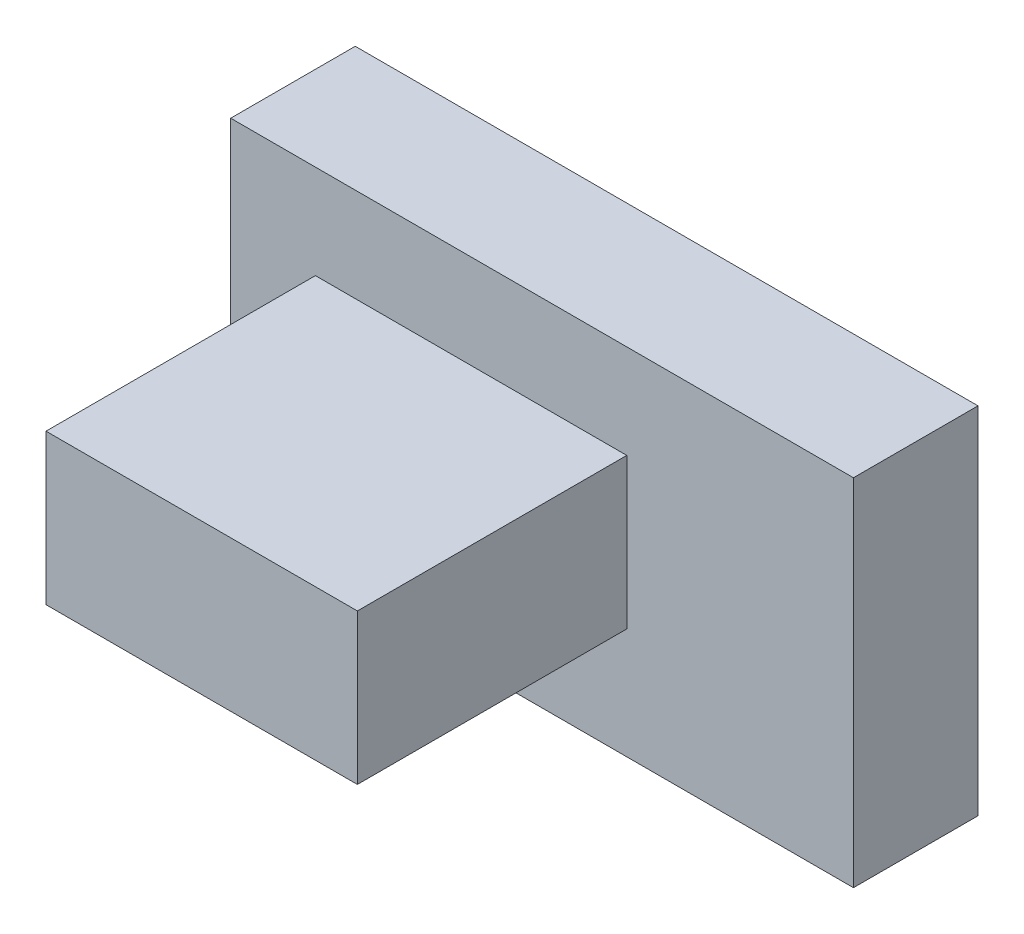
ISO-10303-21;
HEADER;
FILE_DESCRIPTION(('STEP AP214'),'2;1');
FILE_NAME('part.step','',(''),(''),'','','');
FILE_SCHEMA(('AUTOMOTIVE_DESIGN { 1 0 10303 214 1 1 1 1 }'));
ENDSEC;
DATA;
#1=APPLICATION_CONTEXT('core data for automotive mechanical design processes');
#2=APPLICATION_PROTOCOL_DEFINITION('international standard','automotive_design',2000,#1);
#3=PRODUCT_CONTEXT('',#1,'mechanical');
#4=PRODUCT('Part','Part','',(#3));
#5=PRODUCT_RELATED_PRODUCT_CATEGORY('part','',(#4));
#6=PRODUCT_DEFINITION_FORMATION('','',#4);
#7=PRODUCT_DEFINITION_CONTEXT('part definition',#1,'design');
#8=PRODUCT_DEFINITION('design','',#6,#7);
#9=PRODUCT_DEFINITION_SHAPE('','',#8);
#10=(LENGTH_UNIT() NAMED_UNIT(*) SI_UNIT(.MILLI.,.METRE.));
#11=(NAMED_UNIT(*) PLANE_ANGLE_UNIT() SI_UNIT($,.RADIAN.));
#12=(NAMED_UNIT(*) SI_UNIT($,.STERADIAN.) SOLID_ANGLE_UNIT());
#13=UNCERTAINTY_MEASURE_WITH_UNIT(LENGTH_MEASURE(1.E-05),#10,'distance_accuracy_value','');
#14=(GEOMETRIC_REPRESENTATION_CONTEXT(3) GLOBAL_UNCERTAINTY_ASSIGNED_CONTEXT((#13)) GLOBAL_UNIT_ASSIGNED_CONTEXT((#10,
#11,#12)) REPRESENTATION_CONTEXT('',''));
#15=CARTESIAN_POINT('',(0.,0.,0.));
#16=DIRECTION('',(0.,0.,1.));
#17=DIRECTION('',(1.,0.,0.));
#18=AXIS2_PLACEMENT_3D('',#15,#16,#17);
#19=CARTESIAN_POINT('',(0.,0.,25.4));
#20=DIRECTION('',(0.,0.,-1.));
#21=DIRECTION('',(-1.,0.,0.));
#22=AXIS2_PLACEMENT_3D('',#19,#20,#21);
#23=PLANE('',#22);
#24=DIRECTION('',(0.,-1.,0.));
#25=VECTOR('',#24,1.);
#26=CARTESIAN_POINT('',(0.,0.,25.4));
#27=LINE('',#26,#25);
#28=CARTESIAN_POINT('',(7.5564919335847E-13,72.4072643751494,25.4));
#29=VERTEX_POINT('',#28);
#30=CARTESIAN_POINT('',(0.,0.,25.4));
#31=VERTEX_POINT('',#30);
#32=EDGE_CURVE('E131',#29,#31,#27,.T.);
#33=ORIENTED_EDGE('',*,*,#32,.T.);
#34=DIRECTION('',(1.,0.,0.));
#35=VECTOR('',#34,1.);
#36=CARTESIAN_POINT('',(0.,0.,25.4));
#37=LINE('',#36,#35);
#38=CARTESIAN_POINT('',(127.,0.,25.4));
#39=VERTEX_POINT('',#38);
#40=EDGE_CURVE('E134',#31,#39,#37,.T.);
#41=ORIENTED_EDGE('',*,*,#40,.T.);
#42=DIRECTION('',(0.,1.,0.));
#43=VECTOR('',#42,1.);
#44=CARTESIAN_POINT('',(127.,72.4072643751494,25.4));
#45=LINE('',#44,#43);
#46=CARTESIAN_POINT('',(127.,72.4072643751494,25.4));
#47=VERTEX_POINT('',#46);
#48=EDGE_CURVE('E137',#39,#47,#45,.T.);
#49=ORIENTED_EDGE('',*,*,#48,.T.);
#50=DIRECTION('',(-1.,0.,0.));
#51=VECTOR('',#50,1.);
#52=CARTESIAN_POINT('',(7.5564919335847E-13,72.4072643751494,25.4));
#53=LINE('',#52,#51);
#54=EDGE_CURVE('E139',#47,#29,#53,.T.);
#55=ORIENTED_EDGE('',*,*,#54,.T.);
#56=EDGE_LOOP('',(#33,#41,#49,#55));
#57=FACE_BOUND('',#56,.T.);
#58=DIRECTION('',(-1.,0.,0.));
#59=VECTOR('',#58,1.);
#60=CARTESIAN_POINT('',(80.7719149846469,53.2383421005441,25.4));
#61=LINE('',#60,#59);
#62=CARTESIAN_POINT('',(80.7719149846469,53.2383421005441,25.4));
#63=VERTEX_POINT('',#62);
#64=CARTESIAN_POINT('',(17.2719149846466,53.2383421005441,25.4));
#65=VERTEX_POINT('',#64);
#66=EDGE_CURVE('E52',#63,#65,#61,.T.);
#67=ORIENTED_EDGE('',*,*,#66,.F.);
#68=DIRECTION('',(0.,1.,0.));
#69=VECTOR('',#68,1.);
#70=CARTESIAN_POINT('',(80.7719149846469,22.5905104578228,25.4));
#71=LINE('',#70,#69);
#72=CARTESIAN_POINT('',(80.7719149846469,22.5905104578228,25.4));
#73=VERTEX_POINT('',#72);
#74=EDGE_CURVE('E56',#73,#63,#71,.T.);
#75=ORIENTED_EDGE('',*,*,#74,.F.);
#76=DIRECTION('',(1.,0.,0.));
#77=VECTOR('',#76,1.);
#78=CARTESIAN_POINT('',(17.2719149846469,22.5905104578228,25.4));
#79=LINE('',#78,#77);
#80=CARTESIAN_POINT('',(17.2719149846469,22.5905104578228,25.4));
#81=VERTEX_POINT('',#80);
#82=EDGE_CURVE('E286',#81,#73,#79,.T.);
#83=ORIENTED_EDGE('',*,*,#82,.F.);
#84=DIRECTION('',(0.,-1.,0.));
#85=VECTOR('',#84,1.);
#86=CARTESIAN_POINT('',(17.2719149846466,53.2383421005441,25.4));
#87=LINE('',#86,#85);
#88=EDGE_CURVE('E292',#65,#81,#87,.T.);
#89=ORIENTED_EDGE('',*,*,#88,.F.);
#90=EDGE_LOOP('',(#67,#75,#83,#89));
#91=FACE_BOUND('',#90,.T.);
#92=ADVANCED_FACE('F37',(#57,#91),#23,.F.);
#93=CARTESIAN_POINT('',(0.,0.,25.4));
#94=DIRECTION('',(1.,0.,0.));
#95=DIRECTION('',(0.,1.,0.));
#96=AXIS2_PLACEMENT_3D('',#93,#94,#95);
#97=PLANE('',#96);
#98=DIRECTION('',(0.,-1.,0.));
#99=VECTOR('',#98,1.);
#100=CARTESIAN_POINT('',(0.,0.,0.));
#101=LINE('',#100,#99);
#102=CARTESIAN_POINT('',(7.5564919335847E-13,72.4072643751494,0.));
#103=VERTEX_POINT('',#102);
#104=CARTESIAN_POINT('',(0.,0.,0.));
#105=VERTEX_POINT('',#104);
#106=EDGE_CURVE('E122',#103,#105,#101,.T.);
#107=ORIENTED_EDGE('',*,*,#106,.T.);
#108=DIRECTION('',(0.,0.,-1.));
#109=VECTOR('',#108,1.);
#110=CARTESIAN_POINT('',(0.,0.,25.4));
#111=LINE('',#110,#109);
#112=EDGE_CURVE('E11',#31,#105,#111,.T.);
#113=ORIENTED_EDGE('',*,*,#112,.F.);
#114=ORIENTED_EDGE('',*,*,#32,.F.);
#115=DIRECTION('',(0.,0.,-1.));
#116=VECTOR('',#115,1.);
#117=CARTESIAN_POINT('',(7.5564919335847E-13,72.4072643751494,25.4));
#118=LINE('',#117,#116);
#119=EDGE_CURVE('E140',#29,#103,#118,.T.);
#120=ORIENTED_EDGE('',*,*,#119,.T.);
#121=EDGE_LOOP('',(#107,#113,#114,#120));
#122=FACE_BOUND('',#121,.T.);
#123=ADVANCED_FACE('F39',(#122),#97,.F.);
#124=CARTESIAN_POINT('',(0.,0.,25.4));
#125=DIRECTION('',(0.,1.,0.));
#126=DIRECTION('',(0.,0.,1.));
#127=AXIS2_PLACEMENT_3D('',#124,#125,#126);
#128=PLANE('',#127);
#129=DIRECTION('',(1.,0.,0.));
#130=VECTOR('',#129,1.);
#131=CARTESIAN_POINT('',(0.,0.,0.));
#132=LINE('',#131,#130);
#133=CARTESIAN_POINT('',(127.,0.,0.));
#134=VERTEX_POINT('',#133);
#135=EDGE_CURVE('E125',#105,#134,#132,.T.);
#136=ORIENTED_EDGE('',*,*,#135,.T.);
#137=DIRECTION('',(0.,0.,-1.));
#138=VECTOR('',#137,1.);
#139=CARTESIAN_POINT('',(127.,0.,25.4));
#140=LINE('',#139,#138);
#141=EDGE_CURVE('E45',#39,#134,#140,.T.);
#142=ORIENTED_EDGE('',*,*,#141,.F.);
#143=ORIENTED_EDGE('',*,*,#40,.F.);
#144=ORIENTED_EDGE('',*,*,#112,.T.);
#145=EDGE_LOOP('',(#136,#142,#143,#144));
#146=FACE_BOUND('',#145,.T.);
#147=ADVANCED_FACE('F170',(#146),#128,.F.);
#148=CARTESIAN_POINT('',(127.,72.4072643751494,25.4));
#149=DIRECTION('',(-1.,0.,0.));
#150=DIRECTION('',(0.,0.,1.));
#151=AXIS2_PLACEMENT_3D('',#148,#149,#150);
#152=PLANE('',#151);
#153=DIRECTION('',(0.,1.,0.));
#154=VECTOR('',#153,1.);
#155=CARTESIAN_POINT('',(127.,72.4072643751494,0.));
#156=LINE('',#155,#154);
#157=CARTESIAN_POINT('',(127.,72.4072643751494,0.));
#158=VERTEX_POINT('',#157);
#159=EDGE_CURVE('E143',#134,#158,#156,.T.);
#160=ORIENTED_EDGE('',*,*,#159,.T.);
#161=DIRECTION('',(0.,0.,-1.));
#162=VECTOR('',#161,1.);
#163=CARTESIAN_POINT('',(127.,72.4072643751494,25.4));
#164=LINE('',#163,#162);
#165=EDGE_CURVE('E148',#47,#158,#164,.T.);
#166=ORIENTED_EDGE('',*,*,#165,.F.);
#167=ORIENTED_EDGE('',*,*,#48,.F.);
#168=ORIENTED_EDGE('',*,*,#141,.T.);
#169=EDGE_LOOP('',(#160,#166,#167,#168));
#170=FACE_BOUND('',#169,.T.);
#171=ADVANCED_FACE('F155',(#170),#152,.F.);
#172=CARTESIAN_POINT('',(7.5564919335847E-13,72.4072643751494,25.4));
#173=DIRECTION('',(0.,-1.,0.));
#174=DIRECTION('',(0.,0.,-1.));
#175=AXIS2_PLACEMENT_3D('',#172,#173,#174);
#176=PLANE('',#175);
#177=DIRECTION('',(-1.,0.,0.));
#178=VECTOR('',#177,1.);
#179=CARTESIAN_POINT('',(7.5564919335847E-13,72.4072643751494,0.));
#180=LINE('',#179,#178);
#181=EDGE_CURVE('E135',#158,#103,#180,.T.);
#182=ORIENTED_EDGE('',*,*,#181,.T.);
#183=ORIENTED_EDGE('',*,*,#119,.F.);
#184=ORIENTED_EDGE('',*,*,#54,.F.);
#185=ORIENTED_EDGE('',*,*,#165,.T.);
#186=EDGE_LOOP('',(#182,#183,#184,#185));
#187=FACE_BOUND('',#186,.T.);
#188=ADVANCED_FACE('F164',(#187),#176,.F.);
#189=CARTESIAN_POINT('',(0.,0.,0.));
#190=DIRECTION('',(0.,0.,-1.));
#191=DIRECTION('',(-1.,0.,0.));
#192=AXIS2_PLACEMENT_3D('',#189,#190,#191);
#193=PLANE('',#192);
#194=ORIENTED_EDGE('',*,*,#106,.F.);
#195=ORIENTED_EDGE('',*,*,#181,.F.);
#196=ORIENTED_EDGE('',*,*,#159,.F.);
#197=ORIENTED_EDGE('',*,*,#135,.F.);
#198=EDGE_LOOP('',(#194,#195,#196,#197));
#199=FACE_BOUND('',#198,.T.);
#200=ADVANCED_FACE('F161',(#199),#193,.T.);
#201=CARTESIAN_POINT('',(80.7719149846469,53.2383421005441,80.3383831242345));
#202=DIRECTION('',(0.,-1.,0.));
#203=DIRECTION('',(1.,0.,0.));
#204=AXIS2_PLACEMENT_3D('',#201,#202,#203);
#205=PLANE('',#204);
#206=ORIENTED_EDGE('',*,*,#66,.T.);
#207=DIRECTION('',(0.,0.,-1.));
#208=VECTOR('',#207,1.);
#209=CARTESIAN_POINT('',(17.2719149846466,53.2383421005441,80.3383831242345));
#210=LINE('',#209,#208);
#211=CARTESIAN_POINT('',(17.2719149846466,53.2383421005441,80.3383831242345));
#212=VERTEX_POINT('',#211);
#213=EDGE_CURVE('E105',#212,#65,#210,.T.);
#214=ORIENTED_EDGE('',*,*,#213,.F.);
#215=DIRECTION('',(-1.,0.,0.));
#216=VECTOR('',#215,1.);
#217=CARTESIAN_POINT('',(80.7719149846469,53.2383421005441,80.3383831242345));
#218=LINE('',#217,#216);
#219=CARTESIAN_POINT('',(80.7719149846469,53.2383421005441,80.3383831242345));
#220=VERTEX_POINT('',#219);
#221=EDGE_CURVE('E111',#220,#212,#218,.T.);
#222=ORIENTED_EDGE('',*,*,#221,.F.);
#223=DIRECTION('',(0.,0.,-1.));
#224=VECTOR('',#223,1.);
#225=CARTESIAN_POINT('',(80.7719149846469,53.2383421005441,80.3383831242345));
#226=LINE('',#225,#224);
#227=EDGE_CURVE('E284',#220,#63,#226,.T.);
#228=ORIENTED_EDGE('',*,*,#227,.T.);
#229=EDGE_LOOP('',(#206,#214,#222,#228));
#230=FACE_BOUND('',#229,.T.);
#231=ADVANCED_FACE('F121',(#230),#205,.F.);
#232=CARTESIAN_POINT('',(17.2719149846466,53.2383421005441,80.3383831242345));
#233=DIRECTION('',(1.,0.,0.));
#234=DIRECTION('',(0.,1.,0.));
#235=AXIS2_PLACEMENT_3D('',#232,#233,#234);
#236=PLANE('',#235);
#237=ORIENTED_EDGE('',*,*,#88,.T.);
#238=DIRECTION('',(0.,0.,-1.));
#239=VECTOR('',#238,1.);
#240=CARTESIAN_POINT('',(17.2719149846469,22.5905104578228,80.3383831242345));
#241=LINE('',#240,#239);
#242=CARTESIAN_POINT('',(17.2719149846469,22.5905104578228,80.3383831242345));
#243=VERTEX_POINT('',#242);
#244=EDGE_CURVE('E107',#243,#81,#241,.T.);
#245=ORIENTED_EDGE('',*,*,#244,.F.);
#246=DIRECTION('',(0.,-1.,0.));
#247=VECTOR('',#246,1.);
#248=CARTESIAN_POINT('',(17.2719149846466,53.2383421005441,80.3383831242345));
#249=LINE('',#248,#247);
#250=EDGE_CURVE('E100',#212,#243,#249,.T.);
#251=ORIENTED_EDGE('',*,*,#250,.F.);
#252=ORIENTED_EDGE('',*,*,#213,.T.);
#253=EDGE_LOOP('',(#237,#245,#251,#252));
#254=FACE_BOUND('',#253,.T.);
#255=ADVANCED_FACE('F103',(#254),#236,.F.);
#256=CARTESIAN_POINT('',(17.2719149846469,22.5905104578228,80.3383831242345));
#257=DIRECTION('',(0.,1.,0.));
#258=DIRECTION('',(0.,0.,1.));
#259=AXIS2_PLACEMENT_3D('',#256,#257,#258);
#260=PLANE('',#259);
#261=ORIENTED_EDGE('',*,*,#82,.T.);
#262=DIRECTION('',(0.,0.,-1.));
#263=VECTOR('',#262,1.);
#264=CARTESIAN_POINT('',(80.7719149846469,22.5905104578228,80.3383831242345));
#265=LINE('',#264,#263);
#266=CARTESIAN_POINT('',(80.7719149846469,22.5905104578228,80.3383831242345));
#267=VERTEX_POINT('',#266);
#268=EDGE_CURVE('E127',#267,#73,#265,.T.);
#269=ORIENTED_EDGE('',*,*,#268,.F.);
#270=DIRECTION('',(1.,0.,0.));
#271=VECTOR('',#270,1.);
#272=CARTESIAN_POINT('',(17.2719149846469,22.5905104578228,80.3383831242345));
#273=LINE('',#272,#271);
#274=EDGE_CURVE('E110',#243,#267,#273,.T.);
#275=ORIENTED_EDGE('',*,*,#274,.F.);
#276=ORIENTED_EDGE('',*,*,#244,.T.);
#277=EDGE_LOOP('',(#261,#269,#275,#276));
#278=FACE_BOUND('',#277,.T.);
#279=ADVANCED_FACE('F206',(#278),#260,.F.);
#280=CARTESIAN_POINT('',(80.7719149846469,22.5905104578228,80.3383831242345));
#281=DIRECTION('',(-1.,0.,0.));
#282=DIRECTION('',(0.,0.,1.));
#283=AXIS2_PLACEMENT_3D('',#280,#281,#282);
#284=PLANE('',#283);
#285=ORIENTED_EDGE('',*,*,#74,.T.);
#286=ORIENTED_EDGE('',*,*,#227,.F.);
#287=DIRECTION('',(0.,1.,0.));
#288=VECTOR('',#287,1.);
#289=CARTESIAN_POINT('',(80.7719149846469,22.5905104578228,80.3383831242345));
#290=LINE('',#289,#288);
#291=EDGE_CURVE('E116',#267,#220,#290,.T.);
#292=ORIENTED_EDGE('',*,*,#291,.F.);
#293=ORIENTED_EDGE('',*,*,#268,.T.);
#294=EDGE_LOOP('',(#285,#286,#292,#293));
#295=FACE_BOUND('',#294,.T.);
#296=ADVANCED_FACE('F212',(#295),#284,.F.);
#297=CARTESIAN_POINT('',(0.,0.,80.3383831242345));
#298=DIRECTION('',(0.,0.,1.));
#299=DIRECTION('',(1.,0.,0.));
#300=AXIS2_PLACEMENT_3D('',#297,#298,#299);
#301=PLANE('',#300);
#302=ORIENTED_EDGE('',*,*,#221,.T.);
#303=ORIENTED_EDGE('',*,*,#250,.T.);
#304=ORIENTED_EDGE('',*,*,#274,.T.);
#305=ORIENTED_EDGE('',*,*,#291,.T.);
#306=EDGE_LOOP('',(#302,#303,#304,#305));
#307=FACE_BOUND('',#306,.T.);
#308=ADVANCED_FACE('F114',(#307),#301,.T.);
#309=CLOSED_SHELL('',(#92,#123,#147,#171,#188,#200,#231,#255,#279,#296,#308));
#310=MANIFOLD_SOLID_BREP('B2',#309);
#311=ADVANCED_BREP_SHAPE_REPRESENTATION('',(#18,#310),#14);
#312=SHAPE_DEFINITION_REPRESENTATION(#9,#311);
ENDSEC;
END-ISO-10303-21;
